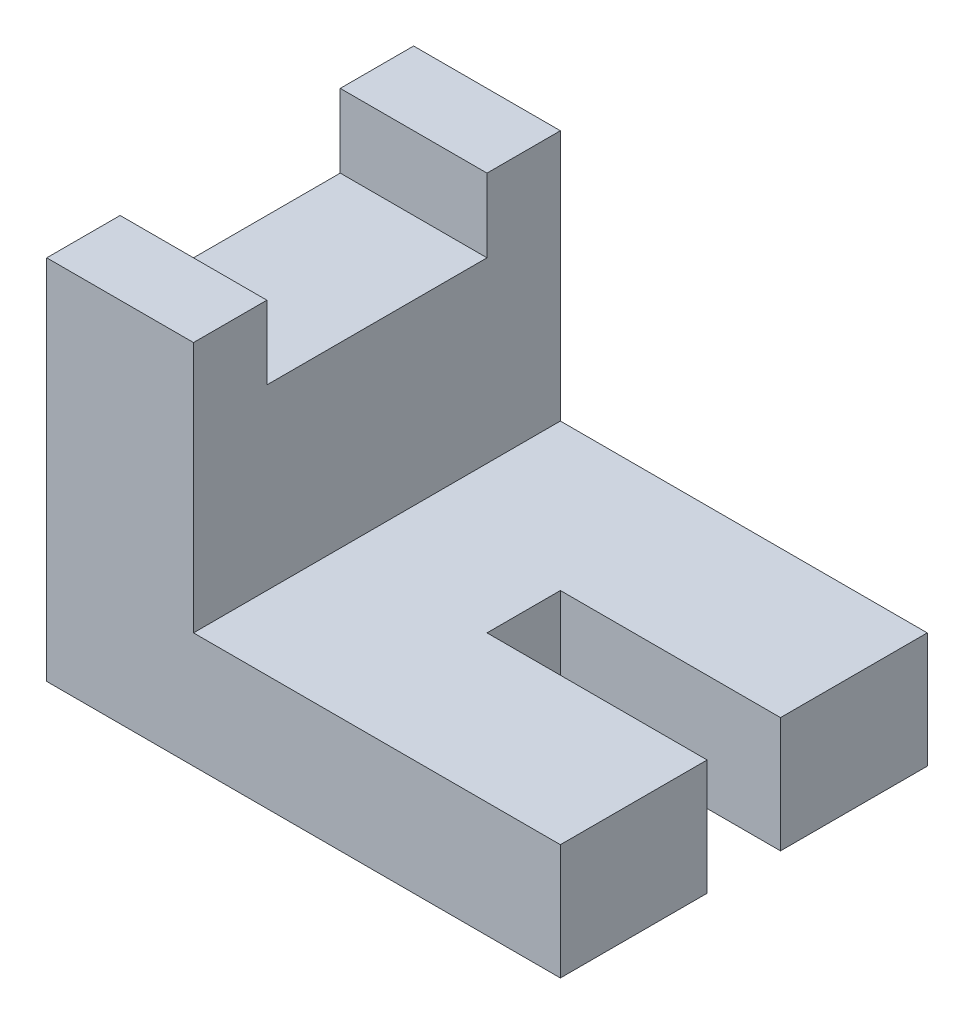
ISO-10303-21;
HEADER;
FILE_DESCRIPTION(('STEP AP214'),'2;1');
FILE_NAME('part.step','',(''),(''),'','','');
FILE_SCHEMA(('AUTOMOTIVE_DESIGN { 1 0 10303 214 1 1 1 1 }'));
ENDSEC;
DATA;
#1=APPLICATION_CONTEXT('core data for automotive mechanical design processes');
#2=APPLICATION_PROTOCOL_DEFINITION('international standard','automotive_design',2000,#1);
#3=PRODUCT_CONTEXT('',#1,'mechanical');
#4=PRODUCT('Part','Part','',(#3));
#5=PRODUCT_RELATED_PRODUCT_CATEGORY('part','',(#4));
#6=PRODUCT_DEFINITION_FORMATION('','',#4);
#7=PRODUCT_DEFINITION_CONTEXT('part definition',#1,'design');
#8=PRODUCT_DEFINITION('design','',#6,#7);
#9=PRODUCT_DEFINITION_SHAPE('','',#8);
#10=(LENGTH_UNIT() NAMED_UNIT(*) SI_UNIT(.MILLI.,.METRE.));
#11=(NAMED_UNIT(*) PLANE_ANGLE_UNIT() SI_UNIT($,.RADIAN.));
#12=(NAMED_UNIT(*) SI_UNIT($,.STERADIAN.) SOLID_ANGLE_UNIT());
#13=UNCERTAINTY_MEASURE_WITH_UNIT(LENGTH_MEASURE(1.E-05),#10,'distance_accuracy_value','');
#14=(GEOMETRIC_REPRESENTATION_CONTEXT(3) GLOBAL_UNCERTAINTY_ASSIGNED_CONTEXT((#13)) GLOBAL_UNIT_ASSIGNED_CONTEXT((#10,
#11,#12)) REPRESENTATION_CONTEXT('',''));
#15=CARTESIAN_POINT('',(0.,0.,0.));
#16=DIRECTION('',(0.,0.,1.));
#17=DIRECTION('',(1.,0.,0.));
#18=AXIS2_PLACEMENT_3D('',#15,#16,#17);
#19=CARTESIAN_POINT('',(26.221600877193,0.,-31.75));
#20=DIRECTION('',(1.,0.,0.));
#21=DIRECTION('',(0.,0.,-1.));
#22=AXIS2_PLACEMENT_3D('',#19,#20,#21);
#23=PLANE('',#22);
#24=DIRECTION('',(0.,1.,0.));
#25=VECTOR('',#24,1.);
#26=CARTESIAN_POINT('',(26.221600877193,0.,-12.7));
#27=LINE('',#26,#25);
#28=CARTESIAN_POINT('',(26.221600877193,0.,-12.7));
#29=VERTEX_POINT('',#28);
#30=CARTESIAN_POINT('',(26.221600877193,9.99150219298246,-12.7));
#31=VERTEX_POINT('',#30);
#32=EDGE_CURVE('E227',#29,#31,#27,.T.);
#33=ORIENTED_EDGE('',*,*,#32,.T.);
#34=DIRECTION('',(0.,0.,1.));
#35=VECTOR('',#34,1.);
#36=CARTESIAN_POINT('',(26.221600877193,9.99150219298246,-31.75));
#37=LINE('',#36,#35);
#38=CARTESIAN_POINT('',(26.221600877193,9.99150219298246,0.));
#39=VERTEX_POINT('',#38);
#40=EDGE_CURVE('E167',#31,#39,#37,.T.);
#41=ORIENTED_EDGE('',*,*,#40,.T.);
#42=DIRECTION('',(0.,1.,0.));
#43=VECTOR('',#42,1.);
#44=CARTESIAN_POINT('',(26.221600877193,0.,0.));
#45=LINE('',#44,#43);
#46=CARTESIAN_POINT('',(26.221600877193,0.,0.));
#47=VERTEX_POINT('',#46);
#48=EDGE_CURVE('E187',#47,#39,#45,.T.);
#49=ORIENTED_EDGE('',*,*,#48,.F.);
#50=DIRECTION('',(0.,0.,1.));
#51=VECTOR('',#50,1.);
#52=CARTESIAN_POINT('',(26.221600877193,0.,-31.75));
#53=LINE('',#52,#51);
#54=EDGE_CURVE('E168',#29,#47,#53,.T.);
#55=ORIENTED_EDGE('',*,*,#54,.F.);
#56=EDGE_LOOP('',(#33,#41,#49,#55));
#57=FACE_BOUND('',#56,.T.);
#58=ADVANCED_FACE('F39',(#57),#23,.T.);
#59=CARTESIAN_POINT('',(-18.228399122807,31.75,-31.75));
#60=DIRECTION('',(-1.,0.,0.));
#61=DIRECTION('',(0.,0.,1.));
#62=AXIS2_PLACEMENT_3D('',#59,#60,#61);
#63=PLANE('',#62);
#64=DIRECTION('',(0.,0.,1.));
#65=VECTOR('',#64,1.);
#66=CARTESIAN_POINT('',(-18.228399122807,25.4,0.));
#67=LINE('',#66,#65);
#68=CARTESIAN_POINT('',(-18.228399122807,25.4,-25.4));
#69=VERTEX_POINT('',#68);
#70=CARTESIAN_POINT('',(-18.228399122807,25.4,-6.35));
#71=VERTEX_POINT('',#70);
#72=EDGE_CURVE('E230',#69,#71,#67,.T.);
#73=ORIENTED_EDGE('',*,*,#72,.F.);
#74=DIRECTION('',(0.,1.,0.));
#75=VECTOR('',#74,1.);
#76=CARTESIAN_POINT('',(-18.228399122807,25.4,-25.4));
#77=LINE('',#76,#75);
#78=CARTESIAN_POINT('',(-18.228399122807,31.75,-25.4));
#79=VERTEX_POINT('',#78);
#80=EDGE_CURVE('E211',#69,#79,#77,.T.);
#81=ORIENTED_EDGE('',*,*,#80,.T.);
#82=DIRECTION('',(0.,0.,1.));
#83=VECTOR('',#82,1.);
#84=CARTESIAN_POINT('',(-18.228399122807,31.75,-31.75));
#85=LINE('',#84,#83);
#86=CARTESIAN_POINT('',(-18.228399122807,31.75,-31.75));
#87=VERTEX_POINT('',#86);
#88=EDGE_CURVE('E11',#87,#79,#85,.T.);
#89=ORIENTED_EDGE('',*,*,#88,.F.);
#90=DIRECTION('',(0.,-1.,0.));
#91=VECTOR('',#90,1.);
#92=CARTESIAN_POINT('',(-18.228399122807,31.75,-31.75));
#93=LINE('',#92,#91);
#94=CARTESIAN_POINT('',(-18.228399122807,0.,-31.75));
#95=VERTEX_POINT('',#94);
#96=EDGE_CURVE('E180',#87,#95,#93,.T.);
#97=ORIENTED_EDGE('',*,*,#96,.T.);
#98=DIRECTION('',(0.,0.,1.));
#99=VECTOR('',#98,1.);
#100=CARTESIAN_POINT('',(-18.228399122807,0.,-31.75));
#101=LINE('',#100,#99);
#102=CARTESIAN_POINT('',(-18.228399122807,0.,0.));
#103=VERTEX_POINT('',#102);
#104=EDGE_CURVE('E43',#95,#103,#101,.T.);
#105=ORIENTED_EDGE('',*,*,#104,.T.);
#106=DIRECTION('',(0.,-1.,0.));
#107=VECTOR('',#106,1.);
#108=CARTESIAN_POINT('',(-18.228399122807,31.75,0.));
#109=LINE('',#108,#107);
#110=CARTESIAN_POINT('',(-18.228399122807,31.75,0.));
#111=VERTEX_POINT('',#110);
#112=EDGE_CURVE('E193',#111,#103,#109,.T.);
#113=ORIENTED_EDGE('',*,*,#112,.F.);
#114=CARTESIAN_POINT('',(-18.228399122807,31.75,-6.35));
#115=VERTEX_POINT('',#114);
#116=EDGE_CURVE('E48',#115,#111,#85,.T.);
#117=ORIENTED_EDGE('',*,*,#116,.F.);
#118=DIRECTION('',(0.,1.,0.));
#119=VECTOR('',#118,1.);
#120=CARTESIAN_POINT('',(-18.228399122807,25.4,-6.35));
#121=LINE('',#120,#119);
#122=EDGE_CURVE('E214',#71,#115,#121,.T.);
#123=ORIENTED_EDGE('',*,*,#122,.F.);
#124=EDGE_LOOP('',(#73,#81,#89,#97,#105,#113,#117,#123));
#125=FACE_BOUND('',#124,.T.);
#126=ADVANCED_FACE('F41',(#125),#63,.T.);
#127=CARTESIAN_POINT('',(-5.52839912280702,31.75,-31.75));
#128=DIRECTION('',(0.,1.,0.));
#129=DIRECTION('',(0.,0.,1.));
#130=AXIS2_PLACEMENT_3D('',#127,#128,#129);
#131=PLANE('',#130);
#132=ORIENTED_EDGE('',*,*,#88,.T.);
#133=DIRECTION('',(1.,0.,0.));
#134=VECTOR('',#133,1.);
#135=CARTESIAN_POINT('',(0.,31.75,-25.4));
#136=LINE('',#135,#134);
#137=CARTESIAN_POINT('',(-5.52839912280702,31.75,-25.4));
#138=VERTEX_POINT('',#137);
#139=EDGE_CURVE('E224',#79,#138,#136,.T.);
#140=ORIENTED_EDGE('',*,*,#139,.T.);
#141=DIRECTION('',(0.,0.,1.));
#142=VECTOR('',#141,1.);
#143=CARTESIAN_POINT('',(-5.52839912280702,31.75,-31.75));
#144=LINE('',#143,#142);
#145=CARTESIAN_POINT('',(-5.52839912280702,31.75,-31.75));
#146=VERTEX_POINT('',#145);
#147=EDGE_CURVE('E174',#146,#138,#144,.T.);
#148=ORIENTED_EDGE('',*,*,#147,.F.);
#149=DIRECTION('',(-1.,0.,0.));
#150=VECTOR('',#149,1.);
#151=CARTESIAN_POINT('',(-5.52839912280702,31.75,-31.75));
#152=LINE('',#151,#150);
#153=EDGE_CURVE('E197',#146,#87,#152,.T.);
#154=ORIENTED_EDGE('',*,*,#153,.T.);
#155=EDGE_LOOP('',(#132,#140,#148,#154));
#156=FACE_BOUND('',#155,.T.);
#157=ADVANCED_FACE('F264',(#156),#131,.T.);
#158=CARTESIAN_POINT('',(-5.52839912280702,9.99150219298245,-31.75));
#159=DIRECTION('',(1.,0.,0.));
#160=DIRECTION('',(0.,1.,0.));
#161=AXIS2_PLACEMENT_3D('',#158,#159,#160);
#162=PLANE('',#161);
#163=ORIENTED_EDGE('',*,*,#147,.T.);
#164=DIRECTION('',(0.,1.,0.));
#165=VECTOR('',#164,1.);
#166=CARTESIAN_POINT('',(-5.52839912280702,25.4,-25.4));
#167=LINE('',#166,#165);
#168=CARTESIAN_POINT('',(-5.52839912280702,25.4,-25.4));
#169=VERTEX_POINT('',#168);
#170=EDGE_CURVE('E196',#169,#138,#167,.T.);
#171=ORIENTED_EDGE('',*,*,#170,.F.);
#172=DIRECTION('',(0.,0.,-1.));
#173=VECTOR('',#172,1.);
#174=CARTESIAN_POINT('',(-5.52839912280702,25.4,0.));
#175=LINE('',#174,#173);
#176=CARTESIAN_POINT('',(-5.52839912280702,25.4,-6.35));
#177=VERTEX_POINT('',#176);
#178=EDGE_CURVE('E215',#177,#169,#175,.T.);
#179=ORIENTED_EDGE('',*,*,#178,.F.);
#180=DIRECTION('',(0.,1.,0.));
#181=VECTOR('',#180,1.);
#182=CARTESIAN_POINT('',(-5.52839912280702,25.4,-6.35));
#183=LINE('',#182,#181);
#184=CARTESIAN_POINT('',(-5.52839912280702,31.75,-6.35));
#185=VERTEX_POINT('',#184);
#186=EDGE_CURVE('E217',#177,#185,#183,.T.);
#187=ORIENTED_EDGE('',*,*,#186,.T.);
#188=CARTESIAN_POINT('',(-5.52839912280702,31.75,0.));
#189=VERTEX_POINT('',#188);
#190=EDGE_CURVE('E173',#185,#189,#144,.T.);
#191=ORIENTED_EDGE('',*,*,#190,.T.);
#192=DIRECTION('',(0.,1.,0.));
#193=VECTOR('',#192,1.);
#194=CARTESIAN_POINT('',(-5.52839912280702,9.99150219298245,0.));
#195=LINE('',#194,#193);
#196=CARTESIAN_POINT('',(-5.52839912280702,9.99150219298245,0.));
#197=VERTEX_POINT('',#196);
#198=EDGE_CURVE('E181',#197,#189,#195,.T.);
#199=ORIENTED_EDGE('',*,*,#198,.F.);
#200=DIRECTION('',(0.,0.,1.));
#201=VECTOR('',#200,1.);
#202=CARTESIAN_POINT('',(-5.52839912280702,9.99150219298245,-31.75));
#203=LINE('',#202,#201);
#204=CARTESIAN_POINT('',(-5.52839912280702,9.99150219298245,-31.75));
#205=VERTEX_POINT('',#204);
#206=EDGE_CURVE('E171',#205,#197,#203,.T.);
#207=ORIENTED_EDGE('',*,*,#206,.F.);
#208=DIRECTION('',(0.,1.,0.));
#209=VECTOR('',#208,1.);
#210=CARTESIAN_POINT('',(-5.52839912280702,9.99150219298245,-31.75));
#211=LINE('',#210,#209);
#212=EDGE_CURVE('E200',#205,#146,#211,.T.);
#213=ORIENTED_EDGE('',*,*,#212,.T.);
#214=EDGE_LOOP('',(#163,#171,#179,#187,#191,#199,#207,#213));
#215=FACE_BOUND('',#214,.T.);
#216=ADVANCED_FACE('F299',(#215),#162,.T.);
#217=DIRECTION('',(1.,0.,0.));
#218=VECTOR('',#217,1.);
#219=CARTESIAN_POINT('',(0.,31.75,-6.35));
#220=LINE('',#219,#218);
#221=EDGE_CURVE('E221',#115,#185,#220,.T.);
#222=ORIENTED_EDGE('',*,*,#221,.F.);
#223=ORIENTED_EDGE('',*,*,#116,.T.);
#224=DIRECTION('',(-1.,0.,0.));
#225=VECTOR('',#224,1.);
#226=CARTESIAN_POINT('',(-5.52839912280702,31.75,0.));
#227=LINE('',#226,#225);
#228=EDGE_CURVE('E177',#189,#111,#227,.T.);
#229=ORIENTED_EDGE('',*,*,#228,.F.);
#230=ORIENTED_EDGE('',*,*,#190,.F.);
#231=EDGE_LOOP('',(#222,#223,#229,#230));
#232=FACE_BOUND('',#231,.T.);
#233=ADVANCED_FACE('F295',(#232),#131,.T.);
#234=CARTESIAN_POINT('',(26.221600877193,9.99150219298246,-31.75));
#235=DIRECTION('',(0.,1.,0.));
#236=DIRECTION('',(-1.,0.,0.));
#237=AXIS2_PLACEMENT_3D('',#234,#235,#236);
#238=PLANE('',#237);
#239=DIRECTION('',(1.,0.,0.));
#240=VECTOR('',#239,1.);
#241=CARTESIAN_POINT('',(26.221600877193,9.99150219298246,-12.7));
#242=LINE('',#241,#240);
#243=CARTESIAN_POINT('',(7.17160087719298,9.99150219298246,-12.7));
#244=VERTEX_POINT('',#243);
#245=EDGE_CURVE('E151',#244,#31,#242,.T.);
#246=ORIENTED_EDGE('',*,*,#245,.F.);
#247=DIRECTION('',(0.,0.,1.));
#248=VECTOR('',#247,1.);
#249=CARTESIAN_POINT('',(7.17160087719298,9.99150219298246,-19.05));
#250=LINE('',#249,#248);
#251=CARTESIAN_POINT('',(7.17160087719298,9.99150219298246,-19.05));
#252=VERTEX_POINT('',#251);
#253=EDGE_CURVE('E239',#252,#244,#250,.T.);
#254=ORIENTED_EDGE('',*,*,#253,.F.);
#255=DIRECTION('',(-1.,0.,0.));
#256=VECTOR('',#255,1.);
#257=CARTESIAN_POINT('',(26.221600877193,9.99150219298246,-19.05));
#258=LINE('',#257,#256);
#259=CARTESIAN_POINT('',(26.221600877193,9.99150219298246,-19.05));
#260=VERTEX_POINT('',#259);
#261=EDGE_CURVE('E242',#260,#252,#258,.T.);
#262=ORIENTED_EDGE('',*,*,#261,.F.);
#263=CARTESIAN_POINT('',(26.221600877193,9.99150219298246,-31.75));
#264=VERTEX_POINT('',#263);
#265=EDGE_CURVE('E159',#264,#260,#37,.T.);
#266=ORIENTED_EDGE('',*,*,#265,.F.);
#267=DIRECTION('',(-1.,0.,0.));
#268=VECTOR('',#267,1.);
#269=CARTESIAN_POINT('',(26.221600877193,9.99150219298246,-31.75));
#270=LINE('',#269,#268);
#271=EDGE_CURVE('E203',#264,#205,#270,.T.);
#272=ORIENTED_EDGE('',*,*,#271,.T.);
#273=ORIENTED_EDGE('',*,*,#206,.T.);
#274=DIRECTION('',(-1.,0.,0.));
#275=VECTOR('',#274,1.);
#276=CARTESIAN_POINT('',(26.221600877193,9.99150219298246,0.));
#277=LINE('',#276,#275);
#278=EDGE_CURVE('E184',#39,#197,#277,.T.);
#279=ORIENTED_EDGE('',*,*,#278,.F.);
#280=ORIENTED_EDGE('',*,*,#40,.F.);
#281=EDGE_LOOP('',(#246,#254,#262,#266,#272,#273,#279,#280));
#282=FACE_BOUND('',#281,.T.);
#283=ADVANCED_FACE('F269',(#282),#238,.T.);
#284=DIRECTION('',(0.,1.,0.));
#285=VECTOR('',#284,1.);
#286=CARTESIAN_POINT('',(26.221600877193,0.,-19.05));
#287=LINE('',#286,#285);
#288=CARTESIAN_POINT('',(26.221600877193,0.,-19.05));
#289=VERTEX_POINT('',#288);
#290=EDGE_CURVE('E146',#289,#260,#287,.T.);
#291=ORIENTED_EDGE('',*,*,#290,.F.);
#292=CARTESIAN_POINT('',(26.221600877193,0.,-31.75));
#293=VERTEX_POINT('',#292);
#294=EDGE_CURVE('E157',#293,#289,#53,.T.);
#295=ORIENTED_EDGE('',*,*,#294,.F.);
#296=DIRECTION('',(0.,1.,0.));
#297=VECTOR('',#296,1.);
#298=CARTESIAN_POINT('',(26.221600877193,0.,-31.75));
#299=LINE('',#298,#297);
#300=EDGE_CURVE('E206',#293,#264,#299,.T.);
#301=ORIENTED_EDGE('',*,*,#300,.T.);
#302=ORIENTED_EDGE('',*,*,#265,.T.);
#303=EDGE_LOOP('',(#291,#295,#301,#302));
#304=FACE_BOUND('',#303,.T.);
#305=ADVANCED_FACE('F155',(#304),#23,.T.);
#306=CARTESIAN_POINT('',(-18.228399122807,0.,-31.75));
#307=DIRECTION('',(0.,-1.,0.));
#308=DIRECTION('',(0.,0.,-1.));
#309=AXIS2_PLACEMENT_3D('',#306,#307,#308);
#310=PLANE('',#309);
#311=DIRECTION('',(1.,0.,0.));
#312=VECTOR('',#311,1.);
#313=CARTESIAN_POINT('',(26.221600877193,0.,-12.7));
#314=LINE('',#313,#312);
#315=CARTESIAN_POINT('',(7.17160087719298,0.,-12.7));
#316=VERTEX_POINT('',#315);
#317=EDGE_CURVE('E160',#316,#29,#314,.T.);
#318=ORIENTED_EDGE('',*,*,#317,.T.);
#319=ORIENTED_EDGE('',*,*,#54,.T.);
#320=DIRECTION('',(1.,0.,0.));
#321=VECTOR('',#320,1.);
#322=CARTESIAN_POINT('',(-18.228399122807,0.,0.));
#323=LINE('',#322,#321);
#324=EDGE_CURVE('E190',#103,#47,#323,.T.);
#325=ORIENTED_EDGE('',*,*,#324,.F.);
#326=ORIENTED_EDGE('',*,*,#104,.F.);
#327=DIRECTION('',(1.,0.,0.));
#328=VECTOR('',#327,1.);
#329=CARTESIAN_POINT('',(-18.228399122807,0.,-31.75));
#330=LINE('',#329,#328);
#331=EDGE_CURVE('E166',#95,#293,#330,.T.);
#332=ORIENTED_EDGE('',*,*,#331,.T.);
#333=ORIENTED_EDGE('',*,*,#294,.T.);
#334=DIRECTION('',(-1.,0.,0.));
#335=VECTOR('',#334,1.);
#336=CARTESIAN_POINT('',(26.221600877193,0.,-19.05));
#337=LINE('',#336,#335);
#338=CARTESIAN_POINT('',(7.17160087719298,0.,-19.05));
#339=VERTEX_POINT('',#338);
#340=EDGE_CURVE('E142',#289,#339,#337,.T.);
#341=ORIENTED_EDGE('',*,*,#340,.T.);
#342=DIRECTION('',(0.,0.,1.));
#343=VECTOR('',#342,1.);
#344=CARTESIAN_POINT('',(7.17160087719298,0.,-19.05));
#345=LINE('',#344,#343);
#346=EDGE_CURVE('E56',#339,#316,#345,.T.);
#347=ORIENTED_EDGE('',*,*,#346,.T.);
#348=EDGE_LOOP('',(#318,#319,#325,#326,#332,#333,#341,#347));
#349=FACE_BOUND('',#348,.T.);
#350=ADVANCED_FACE('F164',(#349),#310,.T.);
#351=CARTESIAN_POINT('',(0.,0.,-31.75));
#352=DIRECTION('',(0.,0.,1.));
#353=DIRECTION('',(1.,0.,0.));
#354=AXIS2_PLACEMENT_3D('',#351,#352,#353);
#355=PLANE('',#354);
#356=ORIENTED_EDGE('',*,*,#96,.F.);
#357=ORIENTED_EDGE('',*,*,#153,.F.);
#358=ORIENTED_EDGE('',*,*,#212,.F.);
#359=ORIENTED_EDGE('',*,*,#271,.F.);
#360=ORIENTED_EDGE('',*,*,#300,.F.);
#361=ORIENTED_EDGE('',*,*,#331,.F.);
#362=EDGE_LOOP('',(#356,#357,#358,#359,#360,#361));
#363=FACE_BOUND('',#362,.T.);
#364=ADVANCED_FACE('F259',(#363),#355,.F.);
#365=CARTESIAN_POINT('',(0.,0.,0.));
#366=DIRECTION('',(0.,0.,1.));
#367=DIRECTION('',(1.,0.,0.));
#368=AXIS2_PLACEMENT_3D('',#365,#366,#367);
#369=PLANE('',#368);
#370=ORIENTED_EDGE('',*,*,#112,.T.);
#371=ORIENTED_EDGE('',*,*,#324,.T.);
#372=ORIENTED_EDGE('',*,*,#48,.T.);
#373=ORIENTED_EDGE('',*,*,#278,.T.);
#374=ORIENTED_EDGE('',*,*,#198,.T.);
#375=ORIENTED_EDGE('',*,*,#228,.T.);
#376=EDGE_LOOP('',(#370,#371,#372,#373,#374,#375));
#377=FACE_BOUND('',#376,.T.);
#378=ADVANCED_FACE('F254',(#377),#369,.T.);
#379=CARTESIAN_POINT('',(0.,25.4,-25.4));
#380=DIRECTION('',(0.,0.,1.));
#381=DIRECTION('',(1.,0.,0.));
#382=AXIS2_PLACEMENT_3D('',#379,#380,#381);
#383=PLANE('',#382);
#384=ORIENTED_EDGE('',*,*,#139,.F.);
#385=ORIENTED_EDGE('',*,*,#80,.F.);
#386=DIRECTION('',(1.,0.,0.));
#387=VECTOR('',#386,1.);
#388=CARTESIAN_POINT('',(0.,25.4,-25.4));
#389=LINE('',#388,#387);
#390=EDGE_CURVE('E223',#69,#169,#389,.T.);
#391=ORIENTED_EDGE('',*,*,#390,.T.);
#392=ORIENTED_EDGE('',*,*,#170,.T.);
#393=EDGE_LOOP('',(#384,#385,#391,#392));
#394=FACE_BOUND('',#393,.T.);
#395=ADVANCED_FACE('F307',(#394),#383,.T.);
#396=CARTESIAN_POINT('',(0.,25.4,-6.35));
#397=DIRECTION('',(0.,0.,1.));
#398=DIRECTION('',(1.,0.,0.));
#399=AXIS2_PLACEMENT_3D('',#396,#397,#398);
#400=PLANE('',#399);
#401=ORIENTED_EDGE('',*,*,#221,.T.);
#402=ORIENTED_EDGE('',*,*,#186,.F.);
#403=DIRECTION('',(1.,0.,0.));
#404=VECTOR('',#403,1.);
#405=CARTESIAN_POINT('',(0.,25.4,-6.35));
#406=LINE('',#405,#404);
#407=EDGE_CURVE('E64',#71,#177,#406,.T.);
#408=ORIENTED_EDGE('',*,*,#407,.F.);
#409=ORIENTED_EDGE('',*,*,#122,.T.);
#410=EDGE_LOOP('',(#401,#402,#408,#409));
#411=FACE_BOUND('',#410,.T.);
#412=ADVANCED_FACE('F282',(#411),#400,.F.);
#413=CARTESIAN_POINT('',(0.,25.4,0.));
#414=DIRECTION('',(0.,1.,0.));
#415=DIRECTION('',(0.,0.,1.));
#416=AXIS2_PLACEMENT_3D('',#413,#414,#415);
#417=PLANE('',#416);
#418=ORIENTED_EDGE('',*,*,#390,.F.);
#419=ORIENTED_EDGE('',*,*,#72,.T.);
#420=ORIENTED_EDGE('',*,*,#407,.T.);
#421=ORIENTED_EDGE('',*,*,#178,.T.);
#422=EDGE_LOOP('',(#418,#419,#420,#421));
#423=FACE_BOUND('',#422,.T.);
#424=ADVANCED_FACE('F275',(#423),#417,.T.);
#425=CARTESIAN_POINT('',(26.221600877193,0.,-12.7));
#426=DIRECTION('',(0.,0.,1.));
#427=DIRECTION('',(1.,0.,0.));
#428=AXIS2_PLACEMENT_3D('',#425,#426,#427);
#429=PLANE('',#428);
#430=ORIENTED_EDGE('',*,*,#245,.T.);
#431=ORIENTED_EDGE('',*,*,#32,.F.);
#432=ORIENTED_EDGE('',*,*,#317,.F.);
#433=DIRECTION('',(0.,1.,0.));
#434=VECTOR('',#433,1.);
#435=CARTESIAN_POINT('',(7.17160087719298,0.,-12.7));
#436=LINE('',#435,#434);
#437=EDGE_CURVE('E234',#316,#244,#436,.T.);
#438=ORIENTED_EDGE('',*,*,#437,.T.);
#439=EDGE_LOOP('',(#430,#431,#432,#438));
#440=FACE_BOUND('',#439,.T.);
#441=ADVANCED_FACE('F273',(#440),#429,.F.);
#442=CARTESIAN_POINT('',(7.17160087719298,0.,-19.05));
#443=DIRECTION('',(-1.,0.,0.));
#444=DIRECTION('',(0.,-1.,0.));
#445=AXIS2_PLACEMENT_3D('',#442,#443,#444);
#446=PLANE('',#445);
#447=ORIENTED_EDGE('',*,*,#253,.T.);
#448=ORIENTED_EDGE('',*,*,#437,.F.);
#449=ORIENTED_EDGE('',*,*,#346,.F.);
#450=DIRECTION('',(0.,1.,0.));
#451=VECTOR('',#450,1.);
#452=CARTESIAN_POINT('',(7.17160087719298,0.,-19.05));
#453=LINE('',#452,#451);
#454=EDGE_CURVE('E148',#339,#252,#453,.T.);
#455=ORIENTED_EDGE('',*,*,#454,.T.);
#456=EDGE_LOOP('',(#447,#448,#449,#455));
#457=FACE_BOUND('',#456,.T.);
#458=ADVANCED_FACE('F272',(#457),#446,.F.);
#459=CARTESIAN_POINT('',(26.221600877193,0.,-19.05));
#460=DIRECTION('',(0.,0.,-1.));
#461=DIRECTION('',(-1.,0.,0.));
#462=AXIS2_PLACEMENT_3D('',#459,#460,#461);
#463=PLANE('',#462);
#464=ORIENTED_EDGE('',*,*,#261,.T.);
#465=ORIENTED_EDGE('',*,*,#454,.F.);
#466=ORIENTED_EDGE('',*,*,#340,.F.);
#467=ORIENTED_EDGE('',*,*,#290,.T.);
#468=EDGE_LOOP('',(#464,#465,#466,#467));
#469=FACE_BOUND('',#468,.T.);
#470=ADVANCED_FACE('F145',(#469),#463,.F.);
#471=CLOSED_SHELL('',(#58,#126,#157,#216,#233,#283,#305,#350,#364,#378,#395,#412,#424,#441,#458,#470));
#472=MANIFOLD_SOLID_BREP('B2',#471);
#473=ADVANCED_BREP_SHAPE_REPRESENTATION('',(#18,#472),#14);
#474=SHAPE_DEFINITION_REPRESENTATION(#9,#473);
ENDSEC;
END-ISO-10303-21;
